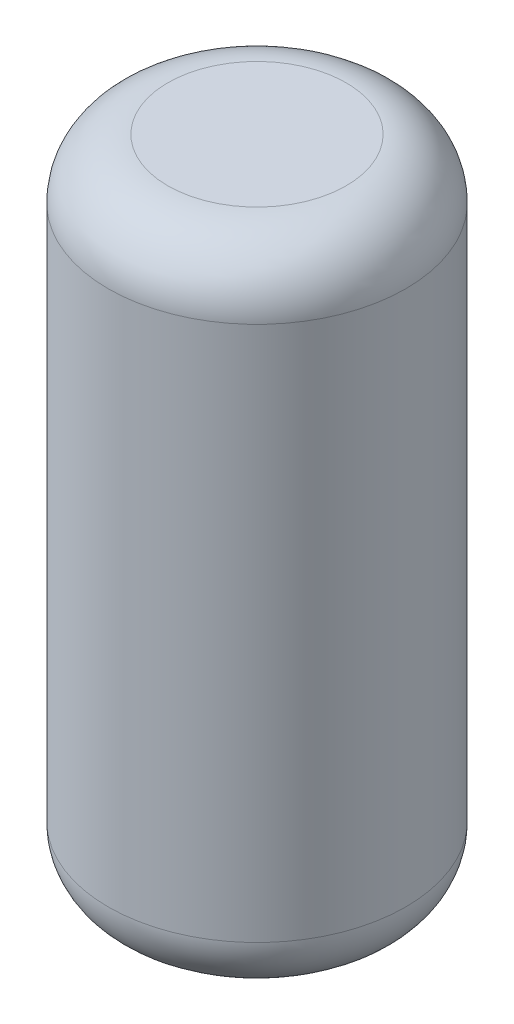
ISO-10303-21;
HEADER;
FILE_DESCRIPTION(('STEP AP214'),'2;1');
FILE_NAME('part.step','',(''),(''),'','','');
FILE_SCHEMA(('AUTOMOTIVE_DESIGN { 1 0 10303 214 1 1 1 1 }'));
ENDSEC;
DATA;
#1=APPLICATION_CONTEXT('core data for automotive mechanical design processes');
#2=APPLICATION_PROTOCOL_DEFINITION('international standard','automotive_design',2000,#1);
#3=PRODUCT_CONTEXT('',#1,'mechanical');
#4=PRODUCT('Part','Part','',(#3));
#5=PRODUCT_RELATED_PRODUCT_CATEGORY('part','',(#4));
#6=PRODUCT_DEFINITION_FORMATION('','',#4);
#7=PRODUCT_DEFINITION_CONTEXT('part definition',#1,'design');
#8=PRODUCT_DEFINITION('design','',#6,#7);
#9=PRODUCT_DEFINITION_SHAPE('','',#8);
#10=(LENGTH_UNIT() NAMED_UNIT(*) SI_UNIT(.MILLI.,.METRE.));
#11=(NAMED_UNIT(*) PLANE_ANGLE_UNIT() SI_UNIT($,.RADIAN.));
#12=(NAMED_UNIT(*) SI_UNIT($,.STERADIAN.) SOLID_ANGLE_UNIT());
#13=UNCERTAINTY_MEASURE_WITH_UNIT(LENGTH_MEASURE(1.E-05),#10,'distance_accuracy_value','');
#14=(GEOMETRIC_REPRESENTATION_CONTEXT(3) GLOBAL_UNCERTAINTY_ASSIGNED_CONTEXT((#13)) GLOBAL_UNIT_ASSIGNED_CONTEXT((#10,
#11,#12)) REPRESENTATION_CONTEXT('',''));
#15=CARTESIAN_POINT('',(0.,0.,0.));
#16=DIRECTION('',(0.,0.,1.));
#17=DIRECTION('',(1.,0.,0.));
#18=AXIS2_PLACEMENT_3D('',#15,#16,#17);
#19=CARTESIAN_POINT('',(0.,11.,0.));
#20=DIRECTION('',(0.,-1.,0.));
#21=DIRECTION('',(0.,0.,-1.));
#22=AXIS2_PLACEMENT_3D('',#19,#20,#21);
#23=CYLINDRICAL_SURFACE('',#22,2.5);
#24=CARTESIAN_POINT('',(0.,1.,0.));
#25=DIRECTION('',(0.,1.,0.));
#26=DIRECTION('',(0.,0.,1.));
#27=AXIS2_PLACEMENT_3D('',#24,#25,#26);
#28=CIRCLE('',#27,2.5);
#29=CARTESIAN_POINT('',(0.,1.,2.5));
#30=VERTEX_POINT('',#29);
#31=EDGE_CURVE('E42',#30,#30,#28,.T.);
#32=ORIENTED_EDGE('',*,*,#31,.T.);
#33=EDGE_LOOP('',(#32));
#34=FACE_BOUND('',#33,.T.);
#35=CARTESIAN_POINT('',(0.,10.,0.));
#36=DIRECTION('',(0.,1.,0.));
#37=DIRECTION('',(0.,0.,1.));
#38=AXIS2_PLACEMENT_3D('',#35,#36,#37);
#39=CIRCLE('',#38,2.5);
#40=CARTESIAN_POINT('',(0.,10.,2.5));
#41=VERTEX_POINT('',#40);
#42=EDGE_CURVE('E46',#41,#41,#39,.F.);
#43=ORIENTED_EDGE('',*,*,#42,.T.);
#44=EDGE_LOOP('',(#43));
#45=FACE_BOUND('',#44,.T.);
#46=ADVANCED_FACE('F31',(#34,#45),#23,.T.);
#47=CARTESIAN_POINT('',(0.,11.,0.));
#48=DIRECTION('',(0.,1.,0.));
#49=DIRECTION('',(0.,0.,1.));
#50=AXIS2_PLACEMENT_3D('',#47,#48,#49);
#51=PLANE('',#50);
#52=CARTESIAN_POINT('',(0.,11.,0.));
#53=DIRECTION('',(0.,1.,0.));
#54=DIRECTION('',(0.,0.,1.));
#55=AXIS2_PLACEMENT_3D('',#52,#53,#54);
#56=CIRCLE('',#55,1.5);
#57=CARTESIAN_POINT('',(0.,11.,1.5));
#58=VERTEX_POINT('',#57);
#59=EDGE_CURVE('E10',#58,#58,#56,.T.);
#60=ORIENTED_EDGE('',*,*,#59,.T.);
#61=EDGE_LOOP('',(#60));
#62=FACE_BOUND('',#61,.T.);
#63=ADVANCED_FACE('F62',(#62),#51,.T.);
#64=CARTESIAN_POINT('',(0.,0.,0.));
#65=DIRECTION('',(0.,1.,0.));
#66=DIRECTION('',(0.,0.,1.));
#67=AXIS2_PLACEMENT_3D('',#64,#65,#66);
#68=PLANE('',#67);
#69=CARTESIAN_POINT('',(0.,0.,0.));
#70=DIRECTION('',(0.,1.,0.));
#71=DIRECTION('',(0.,0.,1.));
#72=AXIS2_PLACEMENT_3D('',#69,#70,#71);
#73=CIRCLE('',#72,1.5);
#74=CARTESIAN_POINT('',(0.,0.,1.5));
#75=VERTEX_POINT('',#74);
#76=EDGE_CURVE('E38',#75,#75,#73,.F.);
#77=ORIENTED_EDGE('',*,*,#76,.T.);
#78=EDGE_LOOP('',(#77));
#79=FACE_BOUND('',#78,.T.);
#80=ADVANCED_FACE('F59',(#79),#68,.F.);
#81=CARTESIAN_POINT('',(0.,1.,0.));
#82=DIRECTION('',(0.,1.,0.));
#83=DIRECTION('',(0.,0.,1.));
#84=AXIS2_PLACEMENT_3D('',#81,#82,#83);
#85=TOROIDAL_SURFACE('',#84,1.5,1.);
#86=ORIENTED_EDGE('',*,*,#76,.F.);
#87=EDGE_LOOP('',(#86));
#88=FACE_BOUND('',#87,.T.);
#89=ORIENTED_EDGE('',*,*,#31,.F.);
#90=EDGE_LOOP('',(#89));
#91=FACE_BOUND('',#90,.T.);
#92=ADVANCED_FACE('F55',(#88,#91),#85,.T.);
#93=CARTESIAN_POINT('',(0.,10.,0.));
#94=DIRECTION('',(0.,1.,0.));
#95=DIRECTION('',(0.,0.,1.));
#96=AXIS2_PLACEMENT_3D('',#93,#94,#95);
#97=TOROIDAL_SURFACE('',#96,1.5,1.);
#98=ORIENTED_EDGE('',*,*,#42,.F.);
#99=EDGE_LOOP('',(#98));
#100=FACE_BOUND('',#99,.T.);
#101=ORIENTED_EDGE('',*,*,#59,.F.);
#102=EDGE_LOOP('',(#101));
#103=FACE_BOUND('',#102,.T.);
#104=ADVANCED_FACE('F33',(#100,#103),#97,.T.);
#105=CLOSED_SHELL('',(#46,#63,#80,#92,#104));
#106=MANIFOLD_SOLID_BREP('B2',#105);
#107=ADVANCED_BREP_SHAPE_REPRESENTATION('',(#18,#106),#14);
#108=SHAPE_DEFINITION_REPRESENTATION(#9,#107);
ENDSEC;
END-ISO-10303-21;
